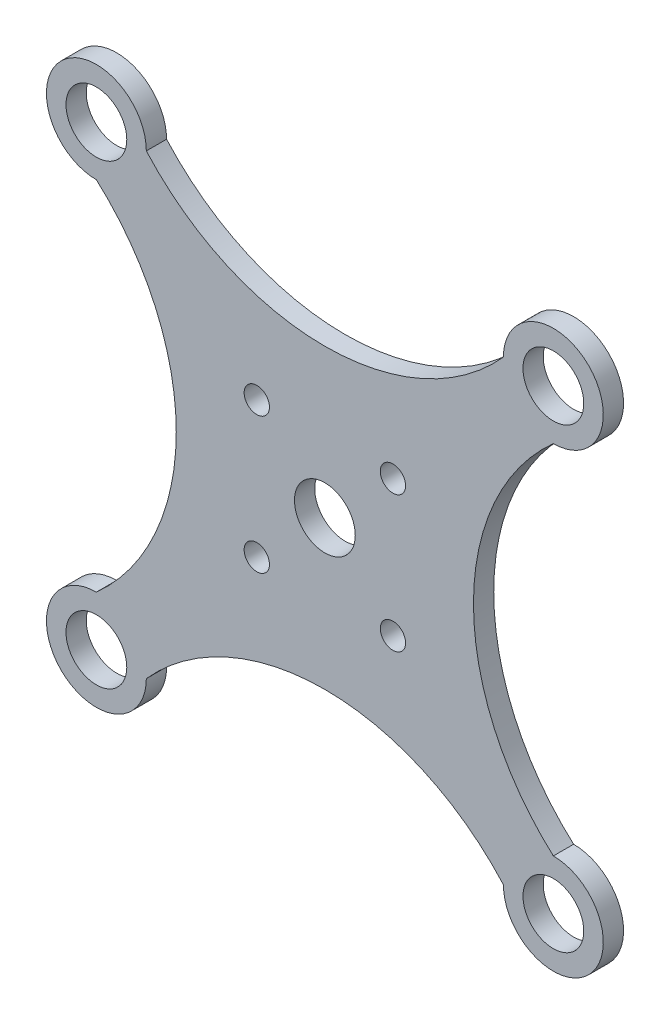
ISO-10303-21;
HEADER;
FILE_DESCRIPTION(('STEP AP214'),'2;1');
FILE_NAME('part.step','',(''),(''),'','','');
FILE_SCHEMA(('AUTOMOTIVE_DESIGN { 1 0 10303 214 1 1 1 1 }'));
ENDSEC;
DATA;
#1=APPLICATION_CONTEXT('core data for automotive mechanical design processes');
#2=APPLICATION_PROTOCOL_DEFINITION('international standard','automotive_design',2000,#1);
#3=PRODUCT_CONTEXT('',#1,'mechanical');
#4=PRODUCT('Part','Part','',(#3));
#5=PRODUCT_RELATED_PRODUCT_CATEGORY('part','',(#4));
#6=PRODUCT_DEFINITION_FORMATION('','',#4);
#7=PRODUCT_DEFINITION_CONTEXT('part definition',#1,'design');
#8=PRODUCT_DEFINITION('design','',#6,#7);
#9=PRODUCT_DEFINITION_SHAPE('','',#8);
#10=(LENGTH_UNIT() NAMED_UNIT(*) SI_UNIT(.MILLI.,.METRE.));
#11=(NAMED_UNIT(*) PLANE_ANGLE_UNIT() SI_UNIT($,.RADIAN.));
#12=(NAMED_UNIT(*) SI_UNIT($,.STERADIAN.) SOLID_ANGLE_UNIT());
#13=UNCERTAINTY_MEASURE_WITH_UNIT(LENGTH_MEASURE(1.E-05),#10,'distance_accuracy_value','');
#14=(GEOMETRIC_REPRESENTATION_CONTEXT(3) GLOBAL_UNCERTAINTY_ASSIGNED_CONTEXT((#13)) GLOBAL_UNIT_ASSIGNED_CONTEXT((#10,
#11,#12)) REPRESENTATION_CONTEXT('',''));
#15=CARTESIAN_POINT('',(0.,0.,0.));
#16=DIRECTION('',(0.,0.,1.));
#17=DIRECTION('',(1.,0.,0.));
#18=AXIS2_PLACEMENT_3D('',#15,#16,#17);
#19=CARTESIAN_POINT('',(0.,0.,2.));
#20=DIRECTION('',(0.,0.,-1.));
#21=DIRECTION('',(-1.,0.,0.));
#22=AXIS2_PLACEMENT_3D('',#19,#20,#21);
#23=PLANE('',#22);
#24=CARTESIAN_POINT('',(8.76035355368288E-13,-38.2989293337203,2.));
#25=DIRECTION('',(0.,0.,1.));
#26=DIRECTION('',(1.,0.,0.));
#27=AXIS2_PLACEMENT_3D('',#24,#25,#26);
#28=CIRCLE('',#27,23.6332763633199);
#29=CARTESIAN_POINT('',(-17.6213203435596,-22.5502525316942,2.));
#30=VERTEX_POINT('',#29);
#31=CARTESIAN_POINT('',(17.6213203435614,-22.5502525316942,2.));
#32=VERTEX_POINT('',#31);
#33=EDGE_CURVE('E444',#30,#32,#28,.F.);
#34=ORIENTED_EDGE('',*,*,#33,.T.);
#35=CARTESIAN_POINT('',(22.5502525316951,-22.5502525316933,2.));
#36=DIRECTION('',(0.,0.,1.));
#37=DIRECTION('',(1.,0.,0.));
#38=AXIS2_PLACEMENT_3D('',#35,#36,#37);
#39=CIRCLE('',#38,4.92893218813366);
#40=CARTESIAN_POINT('',(22.5502525316951,-17.6213203435596,2.));
#41=VERTEX_POINT('',#40);
#42=EDGE_CURVE('E297',#32,#41,#39,.T.);
#43=ORIENTED_EDGE('',*,*,#42,.T.);
#44=CARTESIAN_POINT('',(38.2989293337212,9.02923569245928E-13,2.));
#45=DIRECTION('',(0.,0.,1.));
#46=DIRECTION('',(1.,0.,0.));
#47=AXIS2_PLACEMENT_3D('',#44,#45,#46);
#48=CIRCLE('',#47,23.6332763633199);
#49=CARTESIAN_POINT('',(22.5502525316951,17.6213203435614,2.));
#50=VERTEX_POINT('',#49);
#51=EDGE_CURVE('E260',#41,#50,#48,.F.);
#52=ORIENTED_EDGE('',*,*,#51,.T.);
#53=CARTESIAN_POINT('',(22.5502525316942,22.5502525316951,2.));
#54=DIRECTION('',(0.,0.,1.));
#55=DIRECTION('',(1.,0.,0.));
#56=AXIS2_PLACEMENT_3D('',#53,#54,#55);
#57=CIRCLE('',#56,4.92893218813365);
#58=CARTESIAN_POINT('',(17.6213203435605,22.5502525316951,2.));
#59=VERTEX_POINT('',#58);
#60=EDGE_CURVE('E266',#50,#59,#57,.T.);
#61=ORIENTED_EDGE('',*,*,#60,.T.);
#62=CARTESIAN_POINT('',(0.,38.2989293337212,2.));
#63=DIRECTION('',(0.,0.,1.));
#64=DIRECTION('',(1.,0.,0.));
#65=AXIS2_PLACEMENT_3D('',#62,#63,#64);
#66=CIRCLE('',#65,23.6332763633199);
#67=CARTESIAN_POINT('',(-17.6213203435605,22.5502525316942,2.));
#68=VERTEX_POINT('',#67);
#69=EDGE_CURVE('E258',#59,#68,#66,.F.);
#70=ORIENTED_EDGE('',*,*,#69,.T.);
#71=CARTESIAN_POINT('',(-22.5502525316942,22.5502525316942,2.));
#72=DIRECTION('',(0.,0.,1.));
#73=DIRECTION('',(1.,0.,0.));
#74=AXIS2_PLACEMENT_3D('',#71,#72,#73);
#75=CIRCLE('',#74,4.92893218813365);
#76=CARTESIAN_POINT('',(-22.5502525316942,17.6213203435605,2.));
#77=VERTEX_POINT('',#76);
#78=EDGE_CURVE('E242',#68,#77,#75,.T.);
#79=ORIENTED_EDGE('',*,*,#78,.T.);
#80=CARTESIAN_POINT('',(-38.2989293337203,0.,2.));
#81=DIRECTION('',(0.,0.,1.));
#82=DIRECTION('',(1.,0.,0.));
#83=AXIS2_PLACEMENT_3D('',#80,#81,#82);
#84=CIRCLE('',#83,23.6332763633199);
#85=CARTESIAN_POINT('',(-22.5502525316942,-17.6213203435605,2.));
#86=VERTEX_POINT('',#85);
#87=EDGE_CURVE('E252',#77,#86,#84,.F.);
#88=ORIENTED_EDGE('',*,*,#87,.T.);
#89=CARTESIAN_POINT('',(-22.5502525316933,-22.5502525316942,2.));
#90=DIRECTION('',(0.,0.,1.));
#91=DIRECTION('',(1.,0.,0.));
#92=AXIS2_PLACEMENT_3D('',#89,#90,#91);
#93=CIRCLE('',#92,4.92893218813365);
#94=EDGE_CURVE('E251',#86,#30,#93,.T.);
#95=ORIENTED_EDGE('',*,*,#94,.T.);
#96=EDGE_LOOP('',(#34,#43,#52,#61,#70,#79,#88,#95));
#97=FACE_BOUND('',#96,.T.);
#98=CARTESIAN_POINT('',(-6.71751442127182,-6.7175144212722,2.));
#99=DIRECTION('',(0.,0.,1.));
#100=DIRECTION('',(1.,0.,0.));
#101=AXIS2_PLACEMENT_3D('',#98,#99,#100);
#102=CIRCLE('',#101,1.25);
#103=CARTESIAN_POINT('',(-5.46751442127182,-6.7175144212722,2.));
#104=VERTEX_POINT('',#103);
#105=EDGE_CURVE('E304',#104,#104,#102,.T.);
#106=ORIENTED_EDGE('',*,*,#105,.F.);
#107=EDGE_LOOP('',(#106));
#108=FACE_BOUND('',#107,.T.);
#109=CARTESIAN_POINT('',(-22.5502525316933,-22.5502525316942,2.));
#110=DIRECTION('',(0.,0.,1.));
#111=DIRECTION('',(1.,0.,0.));
#112=AXIS2_PLACEMENT_3D('',#109,#110,#111);
#113=CIRCLE('',#112,3.);
#114=CARTESIAN_POINT('',(-19.5502525316933,-22.5502525316942,2.));
#115=VERTEX_POINT('',#114);
#116=EDGE_CURVE('E310',#115,#115,#113,.T.);
#117=ORIENTED_EDGE('',*,*,#116,.F.);
#118=EDGE_LOOP('',(#117));
#119=FACE_BOUND('',#118,.T.);
#120=CARTESIAN_POINT('',(22.5502525316951,-22.5502525316933,2.));
#121=DIRECTION('',(0.,0.,1.));
#122=DIRECTION('',(1.,0.,0.));
#123=AXIS2_PLACEMENT_3D('',#120,#121,#122);
#124=CIRCLE('',#123,2.99999999999999);
#125=CARTESIAN_POINT('',(25.5502525316951,-22.5502525316933,2.));
#126=VERTEX_POINT('',#125);
#127=EDGE_CURVE('E316',#126,#126,#124,.T.);
#128=ORIENTED_EDGE('',*,*,#127,.F.);
#129=EDGE_LOOP('',(#128));
#130=FACE_BOUND('',#129,.T.);
#131=CARTESIAN_POINT('',(22.5502525316942,22.5502525316951,2.));
#132=DIRECTION('',(0.,0.,1.));
#133=DIRECTION('',(1.,0.,0.));
#134=AXIS2_PLACEMENT_3D('',#131,#132,#133);
#135=CIRCLE('',#134,2.99999999999999);
#136=CARTESIAN_POINT('',(25.5502525316942,22.5502525316951,2.));
#137=VERTEX_POINT('',#136);
#138=EDGE_CURVE('E322',#137,#137,#135,.T.);
#139=ORIENTED_EDGE('',*,*,#138,.F.);
#140=EDGE_LOOP('',(#139));
#141=FACE_BOUND('',#140,.T.);
#142=CARTESIAN_POINT('',(6.71751442127258,-6.71751442127182,2.));
#143=DIRECTION('',(0.,0.,1.));
#144=DIRECTION('',(1.,0.,0.));
#145=AXIS2_PLACEMENT_3D('',#142,#143,#144);
#146=CIRCLE('',#145,1.25);
#147=CARTESIAN_POINT('',(7.96751442127258,-6.71751442127182,2.));
#148=VERTEX_POINT('',#147);
#149=EDGE_CURVE('E328',#148,#148,#146,.T.);
#150=ORIENTED_EDGE('',*,*,#149,.F.);
#151=EDGE_LOOP('',(#150));
#152=FACE_BOUND('',#151,.T.);
#153=CARTESIAN_POINT('',(0.,0.,2.));
#154=DIRECTION('',(0.,0.,1.));
#155=DIRECTION('',(1.,0.,0.));
#156=AXIS2_PLACEMENT_3D('',#153,#154,#155);
#157=CIRCLE('',#156,3.);
#158=CARTESIAN_POINT('',(2.99999999999999,0.,2.));
#159=VERTEX_POINT('',#158);
#160=EDGE_CURVE('E334',#159,#159,#157,.T.);
#161=ORIENTED_EDGE('',*,*,#160,.F.);
#162=EDGE_LOOP('',(#161));
#163=FACE_BOUND('',#162,.T.);
#164=CARTESIAN_POINT('',(-22.5502525316942,22.5502525316942,2.));
#165=DIRECTION('',(0.,0.,1.));
#166=DIRECTION('',(1.,0.,0.));
#167=AXIS2_PLACEMENT_3D('',#164,#165,#166);
#168=CIRCLE('',#167,3.);
#169=CARTESIAN_POINT('',(-19.5502525316942,22.5502525316942,2.));
#170=VERTEX_POINT('',#169);
#171=EDGE_CURVE('E340',#170,#170,#168,.T.);
#172=ORIENTED_EDGE('',*,*,#171,.F.);
#173=EDGE_LOOP('',(#172));
#174=FACE_BOUND('',#173,.T.);
#175=CARTESIAN_POINT('',(6.7175144212722,6.71751442127258,2.));
#176=DIRECTION('',(0.,0.,1.));
#177=DIRECTION('',(1.,0.,0.));
#178=AXIS2_PLACEMENT_3D('',#175,#176,#177);
#179=CIRCLE('',#178,1.25);
#180=CARTESIAN_POINT('',(7.9675144212722,6.71751442127258,2.));
#181=VERTEX_POINT('',#180);
#182=EDGE_CURVE('E346',#181,#181,#179,.T.);
#183=ORIENTED_EDGE('',*,*,#182,.F.);
#184=EDGE_LOOP('',(#183));
#185=FACE_BOUND('',#184,.T.);
#186=CARTESIAN_POINT('',(-6.7175144212722,6.7175144212722,2.));
#187=DIRECTION('',(0.,0.,1.));
#188=DIRECTION('',(1.,0.,0.));
#189=AXIS2_PLACEMENT_3D('',#186,#187,#188);
#190=CIRCLE('',#189,1.25);
#191=CARTESIAN_POINT('',(-5.4675144212722,6.7175144212722,2.));
#192=VERTEX_POINT('',#191);
#193=EDGE_CURVE('E12',#192,#192,#190,.T.);
#194=ORIENTED_EDGE('',*,*,#193,.F.);
#195=EDGE_LOOP('',(#194));
#196=FACE_BOUND('',#195,.T.);
#197=ADVANCED_FACE('F180',(#97,#108,#119,#130,#141,#152,#163,#174,#185,#196),#23,.F.);
#198=CARTESIAN_POINT('',(0.,0.,0.));
#199=DIRECTION('',(0.,0.,-1.));
#200=DIRECTION('',(-1.,0.,0.));
#201=AXIS2_PLACEMENT_3D('',#198,#199,#200);
#202=PLANE('',#201);
#203=CARTESIAN_POINT('',(22.5502525316951,-22.5502525316933,0.));
#204=DIRECTION('',(0.,0.,1.));
#205=DIRECTION('',(1.,0.,0.));
#206=AXIS2_PLACEMENT_3D('',#203,#204,#205);
#207=CIRCLE('',#206,4.92893218813366);
#208=CARTESIAN_POINT('',(17.6213203435614,-22.5502525316942,0.));
#209=VERTEX_POINT('',#208);
#210=CARTESIAN_POINT('',(22.5502525316951,-17.6213203435596,0.));
#211=VERTEX_POINT('',#210);
#212=EDGE_CURVE('E292',#209,#211,#207,.T.);
#213=ORIENTED_EDGE('',*,*,#212,.F.);
#214=CARTESIAN_POINT('',(8.76035355368288E-13,-38.2989293337203,0.));
#215=DIRECTION('',(0.,0.,1.));
#216=DIRECTION('',(1.,0.,0.));
#217=AXIS2_PLACEMENT_3D('',#214,#215,#216);
#218=CIRCLE('',#217,23.6332763633199);
#219=CARTESIAN_POINT('',(-17.6213203435596,-22.5502525316942,0.));
#220=VERTEX_POINT('',#219);
#221=EDGE_CURVE('E447',#220,#209,#218,.F.);
#222=ORIENTED_EDGE('',*,*,#221,.F.);
#223=CARTESIAN_POINT('',(-22.5502525316933,-22.5502525316942,0.));
#224=DIRECTION('',(0.,0.,1.));
#225=DIRECTION('',(1.,0.,0.));
#226=AXIS2_PLACEMENT_3D('',#223,#224,#225);
#227=CIRCLE('',#226,4.92893218813365);
#228=CARTESIAN_POINT('',(-22.5502525316942,-17.6213203435605,0.));
#229=VERTEX_POINT('',#228);
#230=EDGE_CURVE('E279',#229,#220,#227,.T.);
#231=ORIENTED_EDGE('',*,*,#230,.F.);
#232=CARTESIAN_POINT('',(-38.2989293337203,0.,0.));
#233=DIRECTION('',(0.,0.,1.));
#234=DIRECTION('',(1.,0.,0.));
#235=AXIS2_PLACEMENT_3D('',#232,#233,#234);
#236=CIRCLE('',#235,23.6332763633199);
#237=CARTESIAN_POINT('',(-22.5502525316942,17.6213203435605,0.));
#238=VERTEX_POINT('',#237);
#239=EDGE_CURVE('E197',#238,#229,#236,.F.);
#240=ORIENTED_EDGE('',*,*,#239,.F.);
#241=CARTESIAN_POINT('',(-22.5502525316942,22.5502525316942,0.));
#242=DIRECTION('',(0.,0.,1.));
#243=DIRECTION('',(1.,0.,0.));
#244=AXIS2_PLACEMENT_3D('',#241,#242,#243);
#245=CIRCLE('',#244,4.92893218813365);
#246=CARTESIAN_POINT('',(-17.6213203435605,22.5502525316942,0.));
#247=VERTEX_POINT('',#246);
#248=EDGE_CURVE('E228',#247,#238,#245,.T.);
#249=ORIENTED_EDGE('',*,*,#248,.F.);
#250=CARTESIAN_POINT('',(0.,38.2989293337212,0.));
#251=DIRECTION('',(0.,0.,1.));
#252=DIRECTION('',(1.,0.,0.));
#253=AXIS2_PLACEMENT_3D('',#250,#251,#252);
#254=CIRCLE('',#253,23.6332763633199);
#255=CARTESIAN_POINT('',(17.6213203435605,22.5502525316951,0.));
#256=VERTEX_POINT('',#255);
#257=EDGE_CURVE('E259',#256,#247,#254,.F.);
#258=ORIENTED_EDGE('',*,*,#257,.F.);
#259=CARTESIAN_POINT('',(22.5502525316942,22.5502525316951,0.));
#260=DIRECTION('',(0.,0.,1.));
#261=DIRECTION('',(1.,0.,0.));
#262=AXIS2_PLACEMENT_3D('',#259,#260,#261);
#263=CIRCLE('',#262,4.92893218813365);
#264=CARTESIAN_POINT('',(22.5502525316951,17.6213203435614,0.));
#265=VERTEX_POINT('',#264);
#266=EDGE_CURVE('E294',#265,#256,#263,.T.);
#267=ORIENTED_EDGE('',*,*,#266,.F.);
#268=CARTESIAN_POINT('',(38.2989293337212,9.02923569245928E-13,0.));
#269=DIRECTION('',(0.,0.,1.));
#270=DIRECTION('',(1.,0.,0.));
#271=AXIS2_PLACEMENT_3D('',#268,#269,#270);
#272=CIRCLE('',#271,23.6332763633199);
#273=EDGE_CURVE('E290',#211,#265,#272,.F.);
#274=ORIENTED_EDGE('',*,*,#273,.F.);
#275=EDGE_LOOP('',(#213,#222,#231,#240,#249,#258,#267,#274));
#276=FACE_BOUND('',#275,.T.);
#277=CARTESIAN_POINT('',(-22.5502525316933,-22.5502525316942,0.));
#278=DIRECTION('',(0.,0.,1.));
#279=DIRECTION('',(1.,0.,0.));
#280=AXIS2_PLACEMENT_3D('',#277,#278,#279);
#281=CIRCLE('',#280,3.);
#282=CARTESIAN_POINT('',(-19.5502525316933,-22.5502525316942,0.));
#283=VERTEX_POINT('',#282);
#284=EDGE_CURVE('E307',#283,#283,#281,.T.);
#285=ORIENTED_EDGE('',*,*,#284,.T.);
#286=EDGE_LOOP('',(#285));
#287=FACE_BOUND('',#286,.T.);
#288=CARTESIAN_POINT('',(22.5502525316942,22.5502525316951,0.));
#289=DIRECTION('',(0.,0.,1.));
#290=DIRECTION('',(1.,0.,0.));
#291=AXIS2_PLACEMENT_3D('',#288,#289,#290);
#292=CIRCLE('',#291,2.99999999999999);
#293=CARTESIAN_POINT('',(25.5502525316942,22.5502525316951,0.));
#294=VERTEX_POINT('',#293);
#295=EDGE_CURVE('E319',#294,#294,#292,.T.);
#296=ORIENTED_EDGE('',*,*,#295,.T.);
#297=EDGE_LOOP('',(#296));
#298=FACE_BOUND('',#297,.T.);
#299=CARTESIAN_POINT('',(0.,0.,0.));
#300=DIRECTION('',(0.,0.,1.));
#301=DIRECTION('',(1.,0.,0.));
#302=AXIS2_PLACEMENT_3D('',#299,#300,#301);
#303=CIRCLE('',#302,3.);
#304=CARTESIAN_POINT('',(2.99999999999999,0.,0.));
#305=VERTEX_POINT('',#304);
#306=EDGE_CURVE('E331',#305,#305,#303,.T.);
#307=ORIENTED_EDGE('',*,*,#306,.T.);
#308=EDGE_LOOP('',(#307));
#309=FACE_BOUND('',#308,.T.);
#310=CARTESIAN_POINT('',(6.7175144212722,6.71751442127258,0.));
#311=DIRECTION('',(0.,0.,1.));
#312=DIRECTION('',(1.,0.,0.));
#313=AXIS2_PLACEMENT_3D('',#310,#311,#312);
#314=CIRCLE('',#313,1.25);
#315=CARTESIAN_POINT('',(7.9675144212722,6.71751442127258,0.));
#316=VERTEX_POINT('',#315);
#317=EDGE_CURVE('E343',#316,#316,#314,.T.);
#318=ORIENTED_EDGE('',*,*,#317,.T.);
#319=EDGE_LOOP('',(#318));
#320=FACE_BOUND('',#319,.T.);
#321=CARTESIAN_POINT('',(-6.7175144212722,6.7175144212722,0.));
#322=DIRECTION('',(0.,0.,1.));
#323=DIRECTION('',(1.,0.,0.));
#324=AXIS2_PLACEMENT_3D('',#321,#322,#323);
#325=CIRCLE('',#324,1.25);
#326=CARTESIAN_POINT('',(-5.4675144212722,6.7175144212722,0.));
#327=VERTEX_POINT('',#326);
#328=EDGE_CURVE('E184',#327,#327,#325,.T.);
#329=ORIENTED_EDGE('',*,*,#328,.T.);
#330=EDGE_LOOP('',(#329));
#331=FACE_BOUND('',#330,.T.);
#332=CARTESIAN_POINT('',(-22.5502525316942,22.5502525316942,0.));
#333=DIRECTION('',(0.,0.,1.));
#334=DIRECTION('',(1.,0.,0.));
#335=AXIS2_PLACEMENT_3D('',#332,#333,#334);
#336=CIRCLE('',#335,3.);
#337=CARTESIAN_POINT('',(-19.5502525316942,22.5502525316942,0.));
#338=VERTEX_POINT('',#337);
#339=EDGE_CURVE('E337',#338,#338,#336,.T.);
#340=ORIENTED_EDGE('',*,*,#339,.T.);
#341=EDGE_LOOP('',(#340));
#342=FACE_BOUND('',#341,.T.);
#343=CARTESIAN_POINT('',(6.71751442127258,-6.71751442127182,0.));
#344=DIRECTION('',(0.,0.,1.));
#345=DIRECTION('',(1.,0.,0.));
#346=AXIS2_PLACEMENT_3D('',#343,#344,#345);
#347=CIRCLE('',#346,1.25);
#348=CARTESIAN_POINT('',(7.96751442127258,-6.71751442127182,0.));
#349=VERTEX_POINT('',#348);
#350=EDGE_CURVE('E325',#349,#349,#347,.T.);
#351=ORIENTED_EDGE('',*,*,#350,.T.);
#352=EDGE_LOOP('',(#351));
#353=FACE_BOUND('',#352,.T.);
#354=CARTESIAN_POINT('',(22.5502525316951,-22.5502525316933,0.));
#355=DIRECTION('',(0.,0.,1.));
#356=DIRECTION('',(1.,0.,0.));
#357=AXIS2_PLACEMENT_3D('',#354,#355,#356);
#358=CIRCLE('',#357,2.99999999999999);
#359=CARTESIAN_POINT('',(25.5502525316951,-22.5502525316933,0.));
#360=VERTEX_POINT('',#359);
#361=EDGE_CURVE('E313',#360,#360,#358,.T.);
#362=ORIENTED_EDGE('',*,*,#361,.T.);
#363=EDGE_LOOP('',(#362));
#364=FACE_BOUND('',#363,.T.);
#365=CARTESIAN_POINT('',(-6.71751442127182,-6.7175144212722,0.));
#366=DIRECTION('',(0.,0.,1.));
#367=DIRECTION('',(1.,0.,0.));
#368=AXIS2_PLACEMENT_3D('',#365,#366,#367);
#369=CIRCLE('',#368,1.25);
#370=CARTESIAN_POINT('',(-5.46751442127182,-6.7175144212722,0.));
#371=VERTEX_POINT('',#370);
#372=EDGE_CURVE('E288',#371,#371,#369,.T.);
#373=ORIENTED_EDGE('',*,*,#372,.T.);
#374=EDGE_LOOP('',(#373));
#375=FACE_BOUND('',#374,.T.);
#376=ADVANCED_FACE('F182',(#276,#287,#298,#309,#320,#331,#342,#353,#364,#375),#202,.T.);
#377=CARTESIAN_POINT('',(-6.7175144212722,6.7175144212722,2.));
#378=DIRECTION('',(0.,0.,-1.));
#379=DIRECTION('',(-1.,0.,0.));
#380=AXIS2_PLACEMENT_3D('',#377,#378,#379);
#381=CYLINDRICAL_SURFACE('',#380,1.25);
#382=ORIENTED_EDGE('',*,*,#193,.T.);
#383=EDGE_LOOP('',(#382));
#384=FACE_BOUND('',#383,.T.);
#385=ORIENTED_EDGE('',*,*,#328,.F.);
#386=EDGE_LOOP('',(#385));
#387=FACE_BOUND('',#386,.T.);
#388=ADVANCED_FACE('F357',(#384,#387),#381,.F.);
#389=CARTESIAN_POINT('',(6.7175144212722,6.71751442127258,2.));
#390=DIRECTION('',(0.,0.,-1.));
#391=DIRECTION('',(-1.,0.,0.));
#392=AXIS2_PLACEMENT_3D('',#389,#390,#391);
#393=CYLINDRICAL_SURFACE('',#392,1.25);
#394=ORIENTED_EDGE('',*,*,#182,.T.);
#395=EDGE_LOOP('',(#394));
#396=FACE_BOUND('',#395,.T.);
#397=ORIENTED_EDGE('',*,*,#317,.F.);
#398=EDGE_LOOP('',(#397));
#399=FACE_BOUND('',#398,.T.);
#400=ADVANCED_FACE('F354',(#396,#399),#393,.F.);
#401=CARTESIAN_POINT('',(-22.5502525316942,22.5502525316942,2.));
#402=DIRECTION('',(0.,0.,-1.));
#403=DIRECTION('',(-1.,0.,0.));
#404=AXIS2_PLACEMENT_3D('',#401,#402,#403);
#405=CYLINDRICAL_SURFACE('',#404,3.);
#406=ORIENTED_EDGE('',*,*,#171,.T.);
#407=EDGE_LOOP('',(#406));
#408=FACE_BOUND('',#407,.T.);
#409=ORIENTED_EDGE('',*,*,#339,.F.);
#410=EDGE_LOOP('',(#409));
#411=FACE_BOUND('',#410,.T.);
#412=ADVANCED_FACE('F356',(#408,#411),#405,.F.);
#413=CARTESIAN_POINT('',(0.,0.,2.));
#414=DIRECTION('',(0.,0.,-1.));
#415=DIRECTION('',(-1.,0.,0.));
#416=AXIS2_PLACEMENT_3D('',#413,#414,#415);
#417=CYLINDRICAL_SURFACE('',#416,3.);
#418=ORIENTED_EDGE('',*,*,#160,.T.);
#419=EDGE_LOOP('',(#418));
#420=FACE_BOUND('',#419,.T.);
#421=ORIENTED_EDGE('',*,*,#306,.F.);
#422=EDGE_LOOP('',(#421));
#423=FACE_BOUND('',#422,.T.);
#424=ADVANCED_FACE('F364',(#420,#423),#417,.F.);
#425=CARTESIAN_POINT('',(6.71751442127258,-6.71751442127182,2.));
#426=DIRECTION('',(0.,0.,-1.));
#427=DIRECTION('',(-1.,0.,0.));
#428=AXIS2_PLACEMENT_3D('',#425,#426,#427);
#429=CYLINDRICAL_SURFACE('',#428,1.25);
#430=ORIENTED_EDGE('',*,*,#149,.T.);
#431=EDGE_LOOP('',(#430));
#432=FACE_BOUND('',#431,.T.);
#433=ORIENTED_EDGE('',*,*,#350,.F.);
#434=EDGE_LOOP('',(#433));
#435=FACE_BOUND('',#434,.T.);
#436=ADVANCED_FACE('F388',(#432,#435),#429,.F.);
#437=CARTESIAN_POINT('',(22.5502525316942,22.5502525316951,2.));
#438=DIRECTION('',(0.,0.,-1.));
#439=DIRECTION('',(-1.,0.,0.));
#440=AXIS2_PLACEMENT_3D('',#437,#438,#439);
#441=CYLINDRICAL_SURFACE('',#440,2.99999999999999);
#442=ORIENTED_EDGE('',*,*,#138,.T.);
#443=EDGE_LOOP('',(#442));
#444=FACE_BOUND('',#443,.T.);
#445=ORIENTED_EDGE('',*,*,#295,.F.);
#446=EDGE_LOOP('',(#445));
#447=FACE_BOUND('',#446,.T.);
#448=ADVANCED_FACE('F394',(#444,#447),#441,.F.);
#449=CARTESIAN_POINT('',(22.5502525316951,-22.5502525316933,2.));
#450=DIRECTION('',(0.,0.,-1.));
#451=DIRECTION('',(-1.,0.,0.));
#452=AXIS2_PLACEMENT_3D('',#449,#450,#451);
#453=CYLINDRICAL_SURFACE('',#452,2.99999999999999);
#454=ORIENTED_EDGE('',*,*,#127,.T.);
#455=EDGE_LOOP('',(#454));
#456=FACE_BOUND('',#455,.T.);
#457=ORIENTED_EDGE('',*,*,#361,.F.);
#458=EDGE_LOOP('',(#457));
#459=FACE_BOUND('',#458,.T.);
#460=ADVANCED_FACE('F400',(#456,#459),#453,.F.);
#461=CARTESIAN_POINT('',(-22.5502525316933,-22.5502525316942,2.));
#462=DIRECTION('',(0.,0.,-1.));
#463=DIRECTION('',(-1.,0.,0.));
#464=AXIS2_PLACEMENT_3D('',#461,#462,#463);
#465=CYLINDRICAL_SURFACE('',#464,3.);
#466=ORIENTED_EDGE('',*,*,#116,.T.);
#467=EDGE_LOOP('',(#466));
#468=FACE_BOUND('',#467,.T.);
#469=ORIENTED_EDGE('',*,*,#284,.F.);
#470=EDGE_LOOP('',(#469));
#471=FACE_BOUND('',#470,.T.);
#472=ADVANCED_FACE('F404',(#468,#471),#465,.F.);
#473=CARTESIAN_POINT('',(-6.71751442127182,-6.7175144212722,2.));
#474=DIRECTION('',(0.,0.,-1.));
#475=DIRECTION('',(-1.,0.,0.));
#476=AXIS2_PLACEMENT_3D('',#473,#474,#475);
#477=CYLINDRICAL_SURFACE('',#476,1.25);
#478=ORIENTED_EDGE('',*,*,#105,.T.);
#479=EDGE_LOOP('',(#478));
#480=FACE_BOUND('',#479,.T.);
#481=ORIENTED_EDGE('',*,*,#372,.F.);
#482=EDGE_LOOP('',(#481));
#483=FACE_BOUND('',#482,.T.);
#484=ADVANCED_FACE('F408',(#480,#483),#477,.F.);
#485=CARTESIAN_POINT('',(-38.2989293337203,0.,0.));
#486=DIRECTION('',(0.,0.,1.));
#487=DIRECTION('',(1.,0.,0.));
#488=AXIS2_PLACEMENT_3D('',#485,#486,#487);
#489=CYLINDRICAL_SURFACE('',#488,23.6332763633199);
#490=ORIENTED_EDGE('',*,*,#87,.F.);
#491=DIRECTION('',(0.,0.,1.));
#492=VECTOR('',#491,1.);
#493=CARTESIAN_POINT('',(-22.5502525316942,17.6213203435605,0.));
#494=LINE('',#493,#492);
#495=EDGE_CURVE('E246',#238,#77,#494,.T.);
#496=ORIENTED_EDGE('',*,*,#495,.F.);
#497=ORIENTED_EDGE('',*,*,#239,.T.);
#498=DIRECTION('',(0.,0.,1.));
#499=VECTOR('',#498,1.);
#500=CARTESIAN_POINT('',(-22.5502525316942,-17.6213203435605,0.));
#501=LINE('',#500,#499);
#502=EDGE_CURVE('E286',#229,#86,#501,.T.);
#503=ORIENTED_EDGE('',*,*,#502,.T.);
#504=EDGE_LOOP('',(#490,#496,#497,#503));
#505=FACE_BOUND('',#504,.T.);
#506=ADVANCED_FACE('F412',(#505),#489,.F.);
#507=CARTESIAN_POINT('',(-22.5502525316933,-22.5502525316942,0.));
#508=DIRECTION('',(0.,0.,1.));
#509=DIRECTION('',(1.,0.,0.));
#510=AXIS2_PLACEMENT_3D('',#507,#508,#509);
#511=CYLINDRICAL_SURFACE('',#510,4.92893218813365);
#512=ORIENTED_EDGE('',*,*,#94,.F.);
#513=ORIENTED_EDGE('',*,*,#502,.F.);
#514=ORIENTED_EDGE('',*,*,#230,.T.);
#515=DIRECTION('',(0.,0.,1.));
#516=VECTOR('',#515,1.);
#517=CARTESIAN_POINT('',(-17.6213203435596,-22.5502525316942,0.));
#518=LINE('',#517,#516);
#519=EDGE_CURVE('E268',#220,#30,#518,.T.);
#520=ORIENTED_EDGE('',*,*,#519,.T.);
#521=EDGE_LOOP('',(#512,#513,#514,#520));
#522=FACE_BOUND('',#521,.T.);
#523=ADVANCED_FACE('F427',(#522),#511,.T.);
#524=CARTESIAN_POINT('',(-22.5502525316942,22.5502525316942,0.));
#525=DIRECTION('',(0.,0.,1.));
#526=DIRECTION('',(1.,0.,0.));
#527=AXIS2_PLACEMENT_3D('',#524,#525,#526);
#528=CYLINDRICAL_SURFACE('',#527,4.92893218813365);
#529=ORIENTED_EDGE('',*,*,#78,.F.);
#530=DIRECTION('',(0.,0.,1.));
#531=VECTOR('',#530,1.);
#532=CARTESIAN_POINT('',(-17.6213203435605,22.5502525316942,0.));
#533=LINE('',#532,#531);
#534=EDGE_CURVE('E245',#247,#68,#533,.T.);
#535=ORIENTED_EDGE('',*,*,#534,.F.);
#536=ORIENTED_EDGE('',*,*,#248,.T.);
#537=ORIENTED_EDGE('',*,*,#495,.T.);
#538=EDGE_LOOP('',(#529,#535,#536,#537));
#539=FACE_BOUND('',#538,.T.);
#540=ADVANCED_FACE('F244',(#539),#528,.T.);
#541=CARTESIAN_POINT('',(38.2989293337212,9.02923569245928E-13,0.));
#542=DIRECTION('',(0.,0.,1.));
#543=DIRECTION('',(1.,0.,0.));
#544=AXIS2_PLACEMENT_3D('',#541,#542,#543);
#545=CYLINDRICAL_SURFACE('',#544,23.6332763633199);
#546=ORIENTED_EDGE('',*,*,#51,.F.);
#547=DIRECTION('',(0.,0.,1.));
#548=VECTOR('',#547,1.);
#549=CARTESIAN_POINT('',(22.5502525316951,-17.6213203435596,0.));
#550=LINE('',#549,#548);
#551=EDGE_CURVE('E220',#211,#41,#550,.T.);
#552=ORIENTED_EDGE('',*,*,#551,.F.);
#553=ORIENTED_EDGE('',*,*,#273,.T.);
#554=DIRECTION('',(0.,0.,1.));
#555=VECTOR('',#554,1.);
#556=CARTESIAN_POINT('',(22.5502525316951,17.6213203435614,0.));
#557=LINE('',#556,#555);
#558=EDGE_CURVE('E282',#265,#50,#557,.T.);
#559=ORIENTED_EDGE('',*,*,#558,.T.);
#560=EDGE_LOOP('',(#546,#552,#553,#559));
#561=FACE_BOUND('',#560,.T.);
#562=ADVANCED_FACE('F414',(#561),#545,.F.);
#563=CARTESIAN_POINT('',(22.5502525316942,22.5502525316951,0.));
#564=DIRECTION('',(0.,0.,1.));
#565=DIRECTION('',(1.,0.,0.));
#566=AXIS2_PLACEMENT_3D('',#563,#564,#565);
#567=CYLINDRICAL_SURFACE('',#566,4.92893218813365);
#568=ORIENTED_EDGE('',*,*,#60,.F.);
#569=ORIENTED_EDGE('',*,*,#558,.F.);
#570=ORIENTED_EDGE('',*,*,#266,.T.);
#571=DIRECTION('',(0.,0.,1.));
#572=VECTOR('',#571,1.);
#573=CARTESIAN_POINT('',(17.6213203435605,22.5502525316951,0.));
#574=LINE('',#573,#572);
#575=EDGE_CURVE('E261',#256,#59,#574,.T.);
#576=ORIENTED_EDGE('',*,*,#575,.T.);
#577=EDGE_LOOP('',(#568,#569,#570,#576));
#578=FACE_BOUND('',#577,.T.);
#579=ADVANCED_FACE('F417',(#578),#567,.T.);
#580=CARTESIAN_POINT('',(22.5502525316951,-22.5502525316933,0.));
#581=DIRECTION('',(0.,0.,1.));
#582=DIRECTION('',(1.,0.,0.));
#583=AXIS2_PLACEMENT_3D('',#580,#581,#582);
#584=CYLINDRICAL_SURFACE('',#583,4.92893218813366);
#585=ORIENTED_EDGE('',*,*,#42,.F.);
#586=DIRECTION('',(0.,0.,1.));
#587=VECTOR('',#586,1.);
#588=CARTESIAN_POINT('',(17.6213203435614,-22.5502525316942,0.));
#589=LINE('',#588,#587);
#590=EDGE_CURVE('E272',#209,#32,#589,.T.);
#591=ORIENTED_EDGE('',*,*,#590,.F.);
#592=ORIENTED_EDGE('',*,*,#212,.T.);
#593=ORIENTED_EDGE('',*,*,#551,.T.);
#594=EDGE_LOOP('',(#585,#591,#592,#593));
#595=FACE_BOUND('',#594,.T.);
#596=ADVANCED_FACE('F419',(#595),#584,.T.);
#597=CARTESIAN_POINT('',(0.,38.2989293337212,0.));
#598=DIRECTION('',(0.,0.,1.));
#599=DIRECTION('',(1.,0.,0.));
#600=AXIS2_PLACEMENT_3D('',#597,#598,#599);
#601=CYLINDRICAL_SURFACE('',#600,23.6332763633199);
#602=ORIENTED_EDGE('',*,*,#69,.F.);
#603=ORIENTED_EDGE('',*,*,#575,.F.);
#604=ORIENTED_EDGE('',*,*,#257,.T.);
#605=ORIENTED_EDGE('',*,*,#534,.T.);
#606=EDGE_LOOP('',(#602,#603,#604,#605));
#607=FACE_BOUND('',#606,.T.);
#608=ADVANCED_FACE('F256',(#607),#601,.F.);
#609=CARTESIAN_POINT('',(8.76035355368288E-13,-38.2989293337203,0.));
#610=DIRECTION('',(0.,0.,1.));
#611=DIRECTION('',(1.,0.,0.));
#612=AXIS2_PLACEMENT_3D('',#609,#610,#611);
#613=CYLINDRICAL_SURFACE('',#612,23.6332763633199);
#614=ORIENTED_EDGE('',*,*,#33,.F.);
#615=ORIENTED_EDGE('',*,*,#519,.F.);
#616=ORIENTED_EDGE('',*,*,#221,.T.);
#617=ORIENTED_EDGE('',*,*,#590,.T.);
#618=EDGE_LOOP('',(#614,#615,#616,#617));
#619=FACE_BOUND('',#618,.T.);
#620=ADVANCED_FACE('F435',(#619),#613,.F.);
#621=CLOSED_SHELL('',(#197,#376,#388,#400,#412,#424,#436,#448,#460,#472,#484,#506,#523,#540,
#562,#579,#596,#608,#620));
#622=MANIFOLD_SOLID_BREP('B2',#621);
#623=ADVANCED_BREP_SHAPE_REPRESENTATION('',(#18,#622),#14);
#624=SHAPE_DEFINITION_REPRESENTATION(#9,#623);
ENDSEC;
END-ISO-10303-21;
